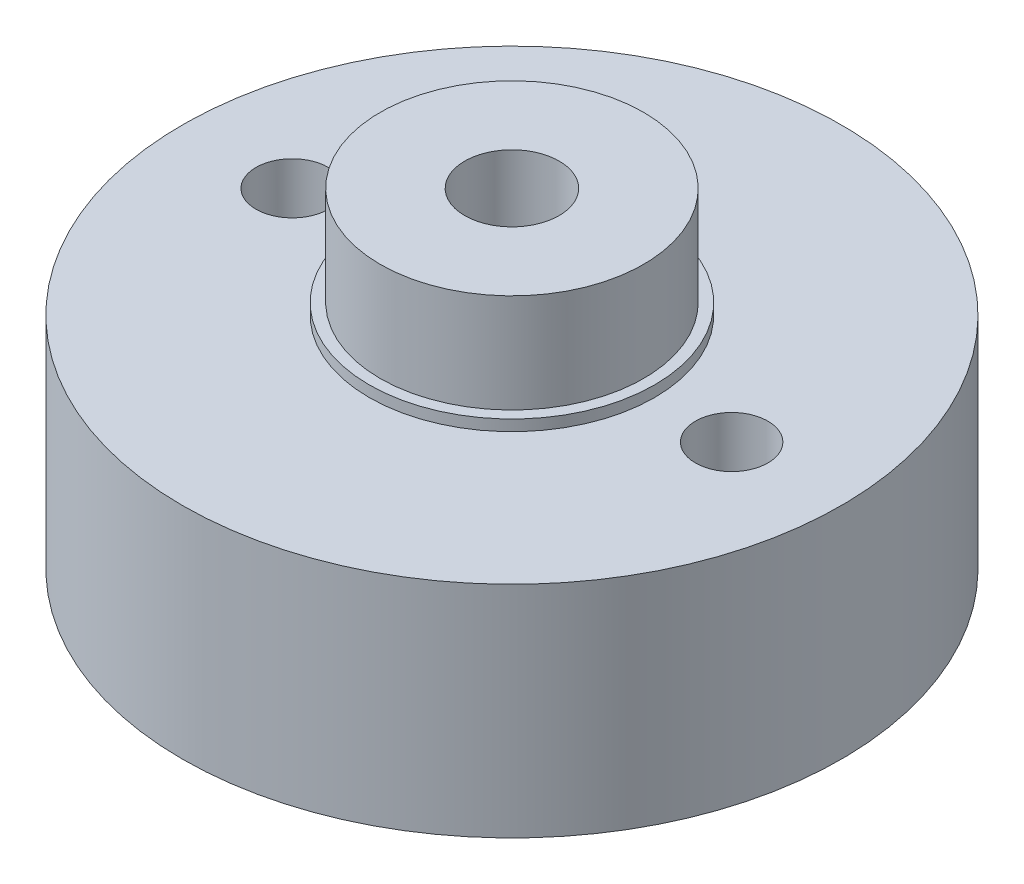
ISO-10303-21;
HEADER;
FILE_DESCRIPTION(('STEP AP214'),'2;1');
FILE_NAME('part.step','',(''),(''),'','','');
FILE_SCHEMA(('AUTOMOTIVE_DESIGN { 1 0 10303 214 1 1 1 1 }'));
ENDSEC;
DATA;
#1=APPLICATION_CONTEXT('core data for automotive mechanical design processes');
#2=APPLICATION_PROTOCOL_DEFINITION('international standard','automotive_design',2000,#1);
#3=PRODUCT_CONTEXT('',#1,'mechanical');
#4=PRODUCT('Part','Part','',(#3));
#5=PRODUCT_RELATED_PRODUCT_CATEGORY('part','',(#4));
#6=PRODUCT_DEFINITION_FORMATION('','',#4);
#7=PRODUCT_DEFINITION_CONTEXT('part definition',#1,'design');
#8=PRODUCT_DEFINITION('design','',#6,#7);
#9=PRODUCT_DEFINITION_SHAPE('','',#8);
#10=(LENGTH_UNIT() NAMED_UNIT(*) SI_UNIT(.MILLI.,.METRE.));
#11=(NAMED_UNIT(*) PLANE_ANGLE_UNIT() SI_UNIT($,.RADIAN.));
#12=(NAMED_UNIT(*) SI_UNIT($,.STERADIAN.) SOLID_ANGLE_UNIT());
#13=UNCERTAINTY_MEASURE_WITH_UNIT(LENGTH_MEASURE(1.E-05),#10,'distance_accuracy_value','');
#14=(GEOMETRIC_REPRESENTATION_CONTEXT(3) GLOBAL_UNCERTAINTY_ASSIGNED_CONTEXT((#13)) GLOBAL_UNIT_ASSIGNED_CONTEXT((#10,
#11,#12)) REPRESENTATION_CONTEXT('',''));
#15=CARTESIAN_POINT('',(0.,0.,0.));
#16=DIRECTION('',(0.,0.,1.));
#17=DIRECTION('',(1.,0.,0.));
#18=AXIS2_PLACEMENT_3D('',#15,#16,#17);
#19=CARTESIAN_POINT('',(0.,10.,0.));
#20=DIRECTION('',(0.,-1.,0.));
#21=DIRECTION('',(0.,0.,-1.));
#22=AXIS2_PLACEMENT_3D('',#19,#20,#21);
#23=CYLINDRICAL_SURFACE('',#22,15.);
#24=CARTESIAN_POINT('',(0.,10.,0.));
#25=DIRECTION('',(0.,1.,0.));
#26=DIRECTION('',(0.,0.,1.));
#27=AXIS2_PLACEMENT_3D('',#24,#25,#26);
#28=CIRCLE('',#27,15.);
#29=CARTESIAN_POINT('',(0.,10.,15.));
#30=VERTEX_POINT('',#29);
#31=EDGE_CURVE('E10',#30,#30,#28,.T.);
#32=ORIENTED_EDGE('',*,*,#31,.F.);
#33=EDGE_LOOP('',(#32));
#34=FACE_BOUND('',#33,.T.);
#35=CARTESIAN_POINT('',(0.,0.,0.));
#36=DIRECTION('',(0.,1.,0.));
#37=DIRECTION('',(0.,0.,1.));
#38=AXIS2_PLACEMENT_3D('',#35,#36,#37);
#39=CIRCLE('',#38,15.);
#40=CARTESIAN_POINT('',(0.,0.,15.));
#41=VERTEX_POINT('',#40);
#42=EDGE_CURVE('E39',#41,#41,#39,.T.);
#43=ORIENTED_EDGE('',*,*,#42,.T.);
#44=EDGE_LOOP('',(#43));
#45=FACE_BOUND('',#44,.T.);
#46=ADVANCED_FACE('F32',(#34,#45),#23,.T.);
#47=CARTESIAN_POINT('',(0.,10.,0.));
#48=DIRECTION('',(0.,1.,0.));
#49=DIRECTION('',(0.,0.,1.));
#50=AXIS2_PLACEMENT_3D('',#47,#48,#49);
#51=PLANE('',#50);
#52=CARTESIAN_POINT('',(10.,10.,0.));
#53=DIRECTION('',(0.,1.,0.));
#54=DIRECTION('',(0.,0.,1.));
#55=AXIS2_PLACEMENT_3D('',#52,#53,#54);
#56=CIRCLE('',#55,1.65);
#57=CARTESIAN_POINT('',(10.,10.,1.65));
#58=VERTEX_POINT('',#57);
#59=EDGE_CURVE('E58',#58,#58,#56,.T.);
#60=ORIENTED_EDGE('',*,*,#59,.F.);
#61=EDGE_LOOP('',(#60));
#62=FACE_BOUND('',#61,.T.);
#63=CARTESIAN_POINT('',(-10.,10.,0.));
#64=DIRECTION('',(0.,1.,0.));
#65=DIRECTION('',(0.,0.,-1.));
#66=AXIS2_PLACEMENT_3D('',#63,#64,#65);
#67=CIRCLE('',#66,1.65);
#68=CARTESIAN_POINT('',(-10.,10.,-1.65));
#69=VERTEX_POINT('',#68);
#70=EDGE_CURVE('E59',#69,#69,#67,.T.);
#71=ORIENTED_EDGE('',*,*,#70,.F.);
#72=EDGE_LOOP('',(#71));
#73=FACE_BOUND('',#72,.T.);
#74=CARTESIAN_POINT('',(0.,10.,0.));
#75=DIRECTION('',(0.,1.,0.));
#76=DIRECTION('',(0.,0.,1.));
#77=AXIS2_PLACEMENT_3D('',#74,#75,#76);
#78=CIRCLE('',#77,6.495);
#79=CARTESIAN_POINT('',(0.,10.,6.495));
#80=VERTEX_POINT('',#79);
#81=EDGE_CURVE('E48',#80,#80,#78,.T.);
#82=ORIENTED_EDGE('',*,*,#81,.F.);
#83=EDGE_LOOP('',(#82));
#84=FACE_BOUND('',#83,.T.);
#85=ORIENTED_EDGE('',*,*,#31,.T.);
#86=EDGE_LOOP('',(#85));
#87=FACE_BOUND('',#86,.T.);
#88=ADVANCED_FACE('F96',(#62,#73,#84,#87),#51,.T.);
#89=CARTESIAN_POINT('',(0.,0.,0.));
#90=DIRECTION('',(0.,1.,0.));
#91=DIRECTION('',(0.,0.,1.));
#92=AXIS2_PLACEMENT_3D('',#89,#90,#91);
#93=PLANE('',#92);
#94=CARTESIAN_POINT('',(0.,0.,0.));
#95=DIRECTION('',(0.,1.,0.));
#96=DIRECTION('',(0.,0.,1.));
#97=AXIS2_PLACEMENT_3D('',#94,#95,#96);
#98=CIRCLE('',#97,2.15);
#99=CARTESIAN_POINT('',(0.,0.,2.15));
#100=VERTEX_POINT('',#99);
#101=EDGE_CURVE('E62',#100,#100,#98,.F.);
#102=ORIENTED_EDGE('',*,*,#101,.F.);
#103=EDGE_LOOP('',(#102));
#104=FACE_BOUND('',#103,.T.);
#105=CARTESIAN_POINT('',(10.,0.,0.));
#106=DIRECTION('',(0.,1.,0.));
#107=DIRECTION('',(0.,0.,1.));
#108=AXIS2_PLACEMENT_3D('',#105,#106,#107);
#109=CIRCLE('',#108,1.65);
#110=CARTESIAN_POINT('',(10.,0.,1.65));
#111=VERTEX_POINT('',#110);
#112=EDGE_CURVE('E52',#111,#111,#109,.F.);
#113=ORIENTED_EDGE('',*,*,#112,.F.);
#114=EDGE_LOOP('',(#113));
#115=FACE_BOUND('',#114,.T.);
#116=CARTESIAN_POINT('',(-10.,0.,0.));
#117=DIRECTION('',(0.,1.,0.));
#118=DIRECTION('',(0.,0.,1.));
#119=AXIS2_PLACEMENT_3D('',#116,#117,#118);
#120=CIRCLE('',#119,1.65);
#121=CARTESIAN_POINT('',(-10.,0.,1.65));
#122=VERTEX_POINT('',#121);
#123=EDGE_CURVE('E55',#122,#122,#120,.F.);
#124=ORIENTED_EDGE('',*,*,#123,.F.);
#125=EDGE_LOOP('',(#124));
#126=FACE_BOUND('',#125,.T.);
#127=ORIENTED_EDGE('',*,*,#42,.F.);
#128=EDGE_LOOP('',(#127));
#129=FACE_BOUND('',#128,.T.);
#130=ADVANCED_FACE('F101',(#104,#115,#126,#129),#93,.F.);
#131=CARTESIAN_POINT('',(0.,10.5,0.));
#132=DIRECTION('',(0.,-1.,0.));
#133=DIRECTION('',(0.,0.,-1.));
#134=AXIS2_PLACEMENT_3D('',#131,#132,#133);
#135=CYLINDRICAL_SURFACE('',#134,6.495);
#136=CARTESIAN_POINT('',(0.,10.5,0.));
#137=DIRECTION('',(0.,1.,0.));
#138=DIRECTION('',(0.,0.,1.));
#139=AXIS2_PLACEMENT_3D('',#136,#137,#138);
#140=CIRCLE('',#139,6.495);
#141=CARTESIAN_POINT('',(0.,10.5,6.495));
#142=VERTEX_POINT('',#141);
#143=EDGE_CURVE('E51',#142,#142,#140,.T.);
#144=ORIENTED_EDGE('',*,*,#143,.F.);
#145=EDGE_LOOP('',(#144));
#146=FACE_BOUND('',#145,.T.);
#147=ORIENTED_EDGE('',*,*,#81,.T.);
#148=EDGE_LOOP('',(#147));
#149=FACE_BOUND('',#148,.T.);
#150=ADVANCED_FACE('F107',(#146,#149),#135,.T.);
#151=CARTESIAN_POINT('',(0.,10.5,0.));
#152=DIRECTION('',(0.,1.,0.));
#153=DIRECTION('',(0.,0.,1.));
#154=AXIS2_PLACEMENT_3D('',#151,#152,#153);
#155=PLANE('',#154);
#156=CARTESIAN_POINT('',(0.,10.5,0.));
#157=DIRECTION('',(0.,1.,0.));
#158=DIRECTION('',(0.,0.,1.));
#159=AXIS2_PLACEMENT_3D('',#156,#157,#158);
#160=CIRCLE('',#159,5.995);
#161=CARTESIAN_POINT('',(0.,10.5,5.995));
#162=VERTEX_POINT('',#161);
#163=EDGE_CURVE('E35',#162,#162,#160,.T.);
#164=ORIENTED_EDGE('',*,*,#163,.F.);
#165=EDGE_LOOP('',(#164));
#166=FACE_BOUND('',#165,.T.);
#167=ORIENTED_EDGE('',*,*,#143,.T.);
#168=EDGE_LOOP('',(#167));
#169=FACE_BOUND('',#168,.T.);
#170=ADVANCED_FACE('F79',(#166,#169),#155,.T.);
#171=CARTESIAN_POINT('',(0.,15.,0.));
#172=DIRECTION('',(0.,1.,0.));
#173=DIRECTION('',(0.,0.,1.));
#174=AXIS2_PLACEMENT_3D('',#171,#172,#173);
#175=PLANE('',#174);
#176=CARTESIAN_POINT('',(0.,15.,0.));
#177=DIRECTION('',(0.,1.,0.));
#178=DIRECTION('',(0.,0.,1.));
#179=AXIS2_PLACEMENT_3D('',#176,#177,#178);
#180=CIRCLE('',#179,2.15);
#181=CARTESIAN_POINT('',(0.,15.,2.15));
#182=VERTEX_POINT('',#181);
#183=EDGE_CURVE('E69',#182,#182,#180,.T.);
#184=ORIENTED_EDGE('',*,*,#183,.F.);
#185=EDGE_LOOP('',(#184));
#186=FACE_BOUND('',#185,.T.);
#187=CARTESIAN_POINT('',(0.,15.,0.));
#188=DIRECTION('',(0.,1.,0.));
#189=DIRECTION('',(0.,0.,1.));
#190=AXIS2_PLACEMENT_3D('',#187,#188,#189);
#191=CIRCLE('',#190,5.995);
#192=CARTESIAN_POINT('',(0.,15.,5.995));
#193=VERTEX_POINT('',#192);
#194=EDGE_CURVE('E44',#193,#193,#191,.T.);
#195=ORIENTED_EDGE('',*,*,#194,.T.);
#196=EDGE_LOOP('',(#195));
#197=FACE_BOUND('',#196,.T.);
#198=ADVANCED_FACE('F75',(#186,#197),#175,.T.);
#199=CARTESIAN_POINT('',(0.,15.,0.));
#200=DIRECTION('',(0.,-1.,0.));
#201=DIRECTION('',(0.,0.,-1.));
#202=AXIS2_PLACEMENT_3D('',#199,#200,#201);
#203=CYLINDRICAL_SURFACE('',#202,5.995);
#204=ORIENTED_EDGE('',*,*,#163,.T.);
#205=EDGE_LOOP('',(#204));
#206=FACE_BOUND('',#205,.T.);
#207=ORIENTED_EDGE('',*,*,#194,.F.);
#208=EDGE_LOOP('',(#207));
#209=FACE_BOUND('',#208,.T.);
#210=ADVANCED_FACE('F78',(#206,#209),#203,.T.);
#211=CARTESIAN_POINT('',(-10.,-4.66690475583122,0.));
#212=DIRECTION('',(0.,1.,0.));
#213=DIRECTION('',(0.,0.,1.));
#214=AXIS2_PLACEMENT_3D('',#211,#212,#213);
#215=CYLINDRICAL_SURFACE('',#214,1.65);
#216=ORIENTED_EDGE('',*,*,#123,.T.);
#217=EDGE_LOOP('',(#216));
#218=FACE_BOUND('',#217,.T.);
#219=ORIENTED_EDGE('',*,*,#70,.T.);
#220=EDGE_LOOP('',(#219));
#221=FACE_BOUND('',#220,.T.);
#222=ADVANCED_FACE('F84',(#218,#221),#215,.F.);
#223=CARTESIAN_POINT('',(10.,-4.66690475583122,0.));
#224=DIRECTION('',(0.,1.,0.));
#225=DIRECTION('',(0.,0.,1.));
#226=AXIS2_PLACEMENT_3D('',#223,#224,#225);
#227=CYLINDRICAL_SURFACE('',#226,1.65);
#228=ORIENTED_EDGE('',*,*,#112,.T.);
#229=EDGE_LOOP('',(#228));
#230=FACE_BOUND('',#229,.T.);
#231=ORIENTED_EDGE('',*,*,#59,.T.);
#232=EDGE_LOOP('',(#231));
#233=FACE_BOUND('',#232,.T.);
#234=ADVANCED_FACE('F90',(#230,#233),#227,.F.);
#235=CARTESIAN_POINT('',(0.,-6.08111831820431,0.));
#236=DIRECTION('',(0.,1.,0.));
#237=DIRECTION('',(0.,0.,1.));
#238=AXIS2_PLACEMENT_3D('',#235,#236,#237);
#239=CYLINDRICAL_SURFACE('',#238,2.15);
#240=ORIENTED_EDGE('',*,*,#101,.T.);
#241=EDGE_LOOP('',(#240));
#242=FACE_BOUND('',#241,.T.);
#243=ORIENTED_EDGE('',*,*,#183,.T.);
#244=EDGE_LOOP('',(#243));
#245=FACE_BOUND('',#244,.T.);
#246=ADVANCED_FACE('F73',(#242,#245),#239,.F.);
#247=CLOSED_SHELL('',(#46,#88,#130,#150,#170,#198,#210,#222,#234,#246));
#248=MANIFOLD_SOLID_BREP('B2',#247);
#249=ADVANCED_BREP_SHAPE_REPRESENTATION('',(#18,#248),#14);
#250=SHAPE_DEFINITION_REPRESENTATION(#9,#249);
ENDSEC;
END-ISO-10303-21;
